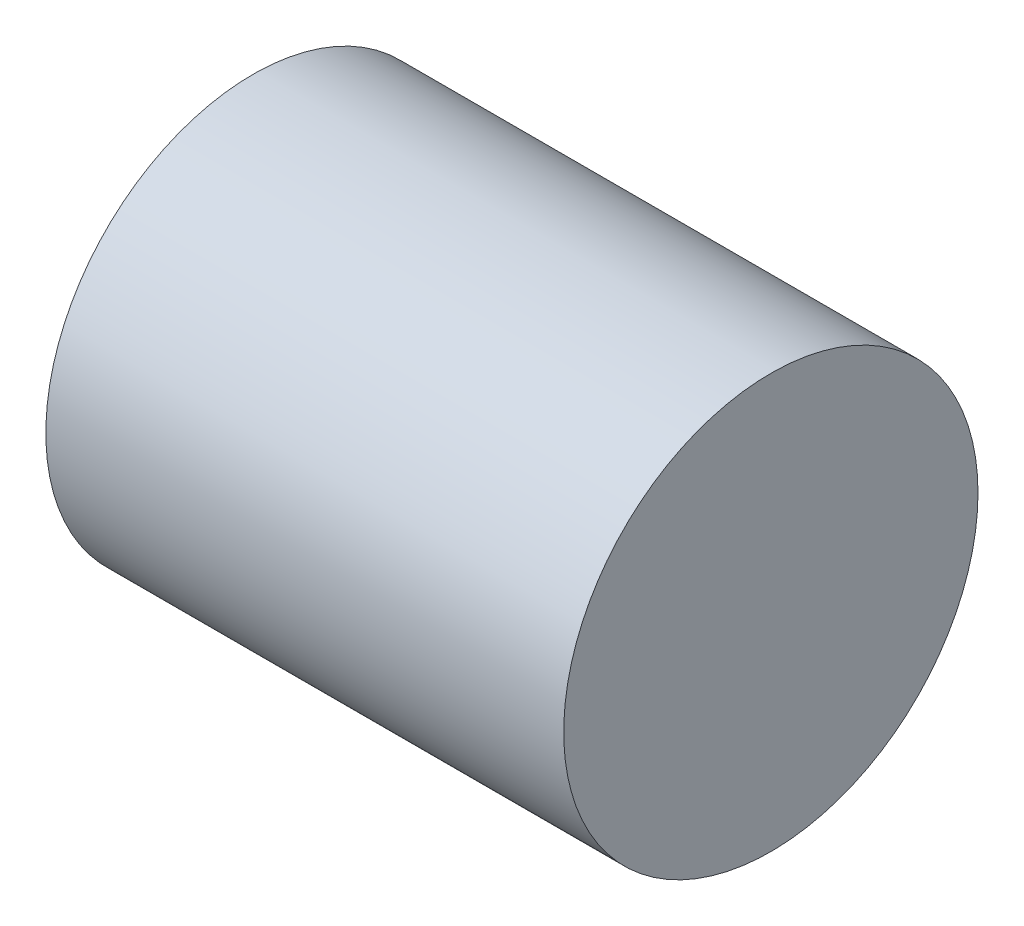
ISO-10303-21;
HEADER;
FILE_DESCRIPTION(('STEP AP214'),'2;1');
FILE_NAME('part.step','',(''),(''),'','','');
FILE_SCHEMA(('AUTOMOTIVE_DESIGN { 1 0 10303 214 1 1 1 1 }'));
ENDSEC;
DATA;
#1=APPLICATION_CONTEXT('core data for automotive mechanical design processes');
#2=APPLICATION_PROTOCOL_DEFINITION('international standard','automotive_design',2000,#1);
#3=PRODUCT_CONTEXT('',#1,'mechanical');
#4=PRODUCT('Part','Part','',(#3));
#5=PRODUCT_RELATED_PRODUCT_CATEGORY('part','',(#4));
#6=PRODUCT_DEFINITION_FORMATION('','',#4);
#7=PRODUCT_DEFINITION_CONTEXT('part definition',#1,'design');
#8=PRODUCT_DEFINITION('design','',#6,#7);
#9=PRODUCT_DEFINITION_SHAPE('','',#8);
#10=(LENGTH_UNIT() NAMED_UNIT(*) SI_UNIT(.MILLI.,.METRE.));
#11=(NAMED_UNIT(*) PLANE_ANGLE_UNIT() SI_UNIT($,.RADIAN.));
#12=(NAMED_UNIT(*) SI_UNIT($,.STERADIAN.) SOLID_ANGLE_UNIT());
#13=UNCERTAINTY_MEASURE_WITH_UNIT(LENGTH_MEASURE(1.E-05),#10,'distance_accuracy_value','');
#14=(GEOMETRIC_REPRESENTATION_CONTEXT(3) GLOBAL_UNCERTAINTY_ASSIGNED_CONTEXT((#13)) GLOBAL_UNIT_ASSIGNED_CONTEXT((#10,
#11,#12)) REPRESENTATION_CONTEXT('',''));
#15=CARTESIAN_POINT('',(0.,0.,0.));
#16=DIRECTION('',(0.,0.,1.));
#17=DIRECTION('',(1.,0.,0.));
#18=AXIS2_PLACEMENT_3D('',#15,#16,#17);
#19=CARTESIAN_POINT('',(5.,0.,0.));
#20=DIRECTION('',(-1.,0.,0.));
#21=DIRECTION('',(0.,0.,1.));
#22=AXIS2_PLACEMENT_3D('',#19,#20,#21);
#23=CYLINDRICAL_SURFACE('',#22,2.);
#24=CARTESIAN_POINT('',(5.,0.,0.));
#25=DIRECTION('',(1.,0.,0.));
#26=DIRECTION('',(0.,0.,-1.));
#27=AXIS2_PLACEMENT_3D('',#24,#25,#26);
#28=CIRCLE('',#27,2.);
#29=CARTESIAN_POINT('',(5.,0.,-2.));
#30=VERTEX_POINT('',#29);
#31=EDGE_CURVE('E10',#30,#30,#28,.T.);
#32=ORIENTED_EDGE('',*,*,#31,.F.);
#33=EDGE_LOOP('',(#32));
#34=FACE_BOUND('',#33,.T.);
#35=CARTESIAN_POINT('',(0.,0.,0.));
#36=DIRECTION('',(1.,0.,0.));
#37=DIRECTION('',(0.,0.,-1.));
#38=AXIS2_PLACEMENT_3D('',#35,#36,#37);
#39=CIRCLE('',#38,2.);
#40=CARTESIAN_POINT('',(0.,0.,-2.));
#41=VERTEX_POINT('',#40);
#42=EDGE_CURVE('E37',#41,#41,#39,.T.);
#43=ORIENTED_EDGE('',*,*,#42,.T.);
#44=EDGE_LOOP('',(#43));
#45=FACE_BOUND('',#44,.T.);
#46=ADVANCED_FACE('F40',(#34,#45),#23,.T.);
#47=CARTESIAN_POINT('',(5.,0.,0.));
#48=DIRECTION('',(1.,0.,0.));
#49=DIRECTION('',(0.,0.,-1.));
#50=AXIS2_PLACEMENT_3D('',#47,#48,#49);
#51=PLANE('',#50);
#52=ORIENTED_EDGE('',*,*,#31,.T.);
#53=EDGE_LOOP('',(#52));
#54=FACE_BOUND('',#53,.T.);
#55=ADVANCED_FACE('F68',(#54),#51,.T.);
#56=CARTESIAN_POINT('',(0.,0.,0.));
#57=DIRECTION('',(1.,0.,0.));
#58=DIRECTION('',(0.,0.,-1.));
#59=AXIS2_PLACEMENT_3D('',#56,#57,#58);
#60=PLANE('',#59);
#61=CARTESIAN_POINT('',(0.,0.,0.));
#62=DIRECTION('',(-1.,0.,0.));
#63=DIRECTION('',(0.,0.,1.));
#64=AXIS2_PLACEMENT_3D('',#61,#62,#63);
#65=CIRCLE('',#64,1.5);
#66=CARTESIAN_POINT('',(0.,0.,1.5));
#67=VERTEX_POINT('',#66);
#68=EDGE_CURVE('E47',#67,#67,#65,.T.);
#69=ORIENTED_EDGE('',*,*,#68,.F.);
#70=EDGE_LOOP('',(#69));
#71=FACE_BOUND('',#70,.T.);
#72=ORIENTED_EDGE('',*,*,#42,.F.);
#73=EDGE_LOOP('',(#72));
#74=FACE_BOUND('',#73,.T.);
#75=ADVANCED_FACE('F58',(#71,#74),#60,.F.);
#76=CARTESIAN_POINT('',(4.,0.,0.));
#77=DIRECTION('',(-1.,0.,0.));
#78=DIRECTION('',(0.,0.,1.));
#79=AXIS2_PLACEMENT_3D('',#76,#77,#78);
#80=CYLINDRICAL_SURFACE('',#79,1.5);
#81=CARTESIAN_POINT('',(4.,0.,0.));
#82=DIRECTION('',(-1.,0.,0.));
#83=DIRECTION('',(0.,0.,1.));
#84=AXIS2_PLACEMENT_3D('',#81,#82,#83);
#85=CIRCLE('',#84,1.5);
#86=CARTESIAN_POINT('',(4.,0.,1.5));
#87=VERTEX_POINT('',#86);
#88=EDGE_CURVE('E50',#87,#87,#85,.T.);
#89=ORIENTED_EDGE('',*,*,#88,.F.);
#90=EDGE_LOOP('',(#89));
#91=FACE_BOUND('',#90,.T.);
#92=ORIENTED_EDGE('',*,*,#68,.T.);
#93=EDGE_LOOP('',(#92));
#94=FACE_BOUND('',#93,.T.);
#95=ADVANCED_FACE('F60',(#91,#94),#80,.F.);
#96=CARTESIAN_POINT('',(4.,0.,0.));
#97=DIRECTION('',(-1.,0.,0.));
#98=DIRECTION('',(0.,0.,1.));
#99=AXIS2_PLACEMENT_3D('',#96,#97,#98);
#100=PLANE('',#99);
#101=ORIENTED_EDGE('',*,*,#88,.T.);
#102=EDGE_LOOP('',(#101));
#103=FACE_BOUND('',#102,.T.);
#104=ADVANCED_FACE('F54',(#103),#100,.T.);
#105=CLOSED_SHELL('',(#46,#55,#75,#95,#104));
#106=MANIFOLD_SOLID_BREP('B2',#105);
#107=ADVANCED_BREP_SHAPE_REPRESENTATION('',(#18,#106),#14);
#108=SHAPE_DEFINITION_REPRESENTATION(#9,#107);
ENDSEC;
END-ISO-10303-21;
